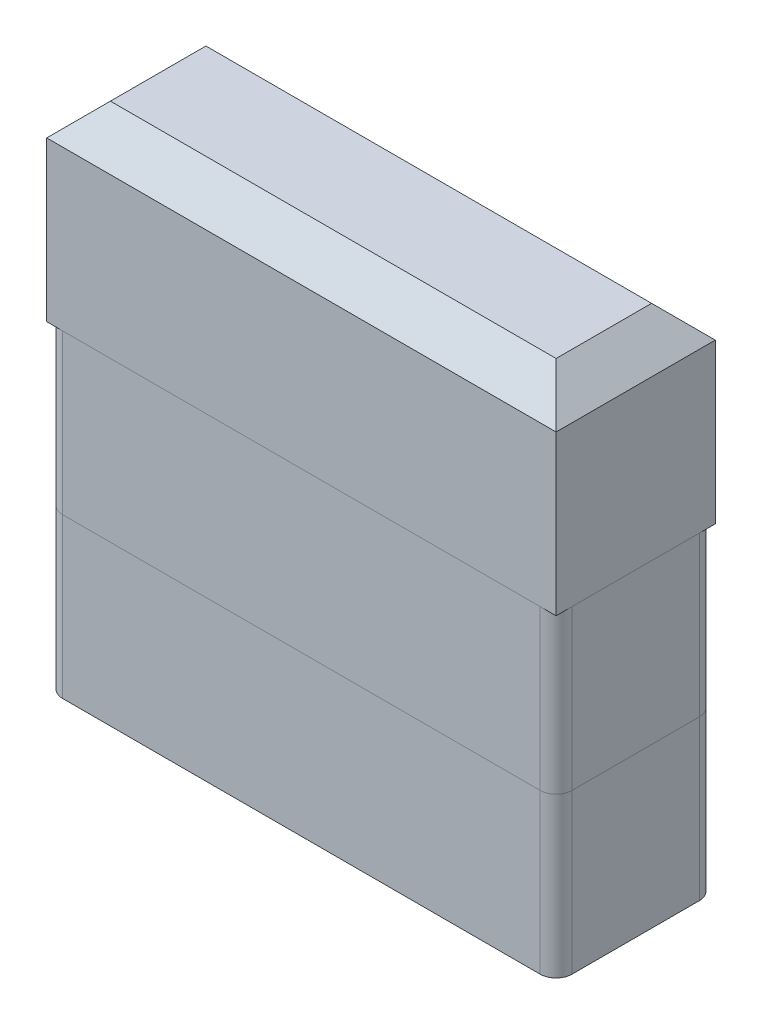
ISO-10303-21;
HEADER;
FILE_DESCRIPTION(('STEP AP214'),'2;1');
FILE_NAME('part.step','',(''),(''),'','','');
FILE_SCHEMA(('AUTOMOTIVE_DESIGN { 1 0 10303 214 1 1 1 1 }'));
ENDSEC;
DATA;
#1=APPLICATION_CONTEXT('core data for automotive mechanical design processes');
#2=APPLICATION_PROTOCOL_DEFINITION('international standard','automotive_design',2000,#1);
#3=PRODUCT_CONTEXT('',#1,'mechanical');
#4=PRODUCT('Part','Part','',(#3));
#5=PRODUCT_RELATED_PRODUCT_CATEGORY('part','',(#4));
#6=PRODUCT_DEFINITION_FORMATION('','',#4);
#7=PRODUCT_DEFINITION_CONTEXT('part definition',#1,'design');
#8=PRODUCT_DEFINITION('design','',#6,#7);
#9=PRODUCT_DEFINITION_SHAPE('','',#8);
#10=(LENGTH_UNIT() NAMED_UNIT(*) SI_UNIT(.MILLI.,.METRE.));
#11=(NAMED_UNIT(*) PLANE_ANGLE_UNIT() SI_UNIT($,.RADIAN.));
#12=(NAMED_UNIT(*) SI_UNIT($,.STERADIAN.) SOLID_ANGLE_UNIT());
#13=UNCERTAINTY_MEASURE_WITH_UNIT(LENGTH_MEASURE(1.E-05),#10,'distance_accuracy_value','');
#14=(GEOMETRIC_REPRESENTATION_CONTEXT(3) GLOBAL_UNCERTAINTY_ASSIGNED_CONTEXT((#13)) GLOBAL_UNIT_ASSIGNED_CONTEXT((#10,
#11,#12)) REPRESENTATION_CONTEXT('',''));
#15=CARTESIAN_POINT('',(0.,0.,0.));
#16=DIRECTION('',(0.,0.,1.));
#17=DIRECTION('',(1.,0.,0.));
#18=AXIS2_PLACEMENT_3D('',#15,#16,#17);
#19=CARTESIAN_POINT('',(0.,100.,0.));
#20=DIRECTION('',(0.,1.,0.));
#21=DIRECTION('',(0.,0.,1.));
#22=AXIS2_PLACEMENT_3D('',#19,#20,#21);
#23=PLANE('',#22);
#24=DIRECTION('',(-1.,0.,0.));
#25=VECTOR('',#24,1.);
#26=CARTESIAN_POINT('',(-80.,100.,-25.));
#27=LINE('',#26,#25);
#28=CARTESIAN_POINT('',(75.,100.,-25.));
#29=VERTEX_POINT('',#28);
#30=CARTESIAN_POINT('',(-75.,100.,-25.));
#31=VERTEX_POINT('',#30);
#32=EDGE_CURVE('E118',#29,#31,#27,.T.);
#33=ORIENTED_EDGE('',*,*,#32,.T.);
#34=CARTESIAN_POINT('',(-75.,100.,-20.));
#35=DIRECTION('',(0.,1.,0.));
#36=DIRECTION('',(0.,0.,1.));
#37=AXIS2_PLACEMENT_3D('',#34,#35,#36);
#38=CIRCLE('',#37,5.);
#39=CARTESIAN_POINT('',(-80.,100.,-20.));
#40=VERTEX_POINT('',#39);
#41=EDGE_CURVE('E114',#31,#40,#38,.T.);
#42=ORIENTED_EDGE('',*,*,#41,.T.);
#43=DIRECTION('',(0.,0.,1.));
#44=VECTOR('',#43,1.);
#45=CARTESIAN_POINT('',(-80.,100.,25.));
#46=LINE('',#45,#44);
#47=CARTESIAN_POINT('',(-80.,100.,20.));
#48=VERTEX_POINT('',#47);
#49=EDGE_CURVE('E116',#40,#48,#46,.T.);
#50=ORIENTED_EDGE('',*,*,#49,.T.);
#51=CARTESIAN_POINT('',(-75.,100.,20.));
#52=DIRECTION('',(0.,1.,0.));
#53=DIRECTION('',(0.,0.,1.));
#54=AXIS2_PLACEMENT_3D('',#51,#52,#53);
#55=CIRCLE('',#54,5.);
#56=CARTESIAN_POINT('',(-75.,100.,25.));
#57=VERTEX_POINT('',#56);
#58=EDGE_CURVE('E70',#48,#57,#55,.T.);
#59=ORIENTED_EDGE('',*,*,#58,.T.);
#60=DIRECTION('',(1.,0.,0.));
#61=VECTOR('',#60,1.);
#62=CARTESIAN_POINT('',(-80.,100.,25.));
#63=LINE('',#62,#61);
#64=CARTESIAN_POINT('',(75.,100.,25.));
#65=VERTEX_POINT('',#64);
#66=EDGE_CURVE('E134',#57,#65,#63,.T.);
#67=ORIENTED_EDGE('',*,*,#66,.T.);
#68=CARTESIAN_POINT('',(75.,100.,20.));
#69=DIRECTION('',(0.,1.,0.));
#70=DIRECTION('',(0.,0.,1.));
#71=AXIS2_PLACEMENT_3D('',#68,#69,#70);
#72=CIRCLE('',#71,5.);
#73=CARTESIAN_POINT('',(80.,100.,20.));
#74=VERTEX_POINT('',#73);
#75=EDGE_CURVE('E156',#65,#74,#72,.T.);
#76=ORIENTED_EDGE('',*,*,#75,.T.);
#77=DIRECTION('',(0.,0.,-1.));
#78=VECTOR('',#77,1.);
#79=CARTESIAN_POINT('',(80.,100.,25.));
#80=LINE('',#79,#78);
#81=CARTESIAN_POINT('',(80.,100.,-20.));
#82=VERTEX_POINT('',#81);
#83=EDGE_CURVE('E133',#74,#82,#80,.T.);
#84=ORIENTED_EDGE('',*,*,#83,.T.);
#85=CARTESIAN_POINT('',(75.,100.,-20.));
#86=DIRECTION('',(0.,1.,0.));
#87=DIRECTION('',(0.,0.,1.));
#88=AXIS2_PLACEMENT_3D('',#85,#86,#87);
#89=CIRCLE('',#88,5.);
#90=EDGE_CURVE('E123',#82,#29,#89,.T.);
#91=ORIENTED_EDGE('',*,*,#90,.T.);
#92=EDGE_LOOP('',(#33,#42,#50,#59,#67,#76,#84,#91));
#93=FACE_BOUND('',#92,.T.);
#94=ADVANCED_FACE('F50',(#93),#23,.T.);
#95=CARTESIAN_POINT('',(-80.,160.,-25.));
#96=DIRECTION('',(0.,0.,1.));
#97=DIRECTION('',(1.,0.,0.));
#98=AXIS2_PLACEMENT_3D('',#95,#96,#97);
#99=PLANE('',#98);
#100=DIRECTION('',(-1.,0.,0.));
#101=VECTOR('',#100,1.);
#102=CARTESIAN_POINT('',(-80.,50.,-25.));
#103=LINE('',#102,#101);
#104=CARTESIAN_POINT('',(75.,50.,-25.));
#105=VERTEX_POINT('',#104);
#106=CARTESIAN_POINT('',(-75.,50.,-25.));
#107=VERTEX_POINT('',#106);
#108=EDGE_CURVE('E172',#105,#107,#103,.T.);
#109=ORIENTED_EDGE('',*,*,#108,.T.);
#110=DIRECTION('',(0.,-1.,0.));
#111=VECTOR('',#110,1.);
#112=CARTESIAN_POINT('',(-75.,160.,-25.));
#113=LINE('',#112,#111);
#114=EDGE_CURVE('E153',#107,#31,#113,.F.);
#115=ORIENTED_EDGE('',*,*,#114,.T.);
#116=ORIENTED_EDGE('',*,*,#32,.F.);
#117=DIRECTION('',(0.,-1.,0.));
#118=VECTOR('',#117,1.);
#119=CARTESIAN_POINT('',(75.,160.,-25.));
#120=LINE('',#119,#118);
#121=EDGE_CURVE('E150',#29,#105,#120,.T.);
#122=ORIENTED_EDGE('',*,*,#121,.T.);
#123=EDGE_LOOP('',(#109,#115,#116,#122));
#124=FACE_BOUND('',#123,.T.);
#125=ADVANCED_FACE('F192',(#124),#99,.F.);
#126=CARTESIAN_POINT('',(80.,160.,25.));
#127=DIRECTION('',(-1.,0.,0.));
#128=DIRECTION('',(0.,0.,1.));
#129=AXIS2_PLACEMENT_3D('',#126,#127,#128);
#130=PLANE('',#129);
#131=DIRECTION('',(0.,0.,-1.));
#132=VECTOR('',#131,1.);
#133=CARTESIAN_POINT('',(80.,50.,25.));
#134=LINE('',#133,#132);
#135=CARTESIAN_POINT('',(80.,50.,20.));
#136=VERTEX_POINT('',#135);
#137=CARTESIAN_POINT('',(80.,50.,-20.));
#138=VERTEX_POINT('',#137);
#139=EDGE_CURVE('E177',#136,#138,#134,.T.);
#140=ORIENTED_EDGE('',*,*,#139,.T.);
#141=DIRECTION('',(0.,-1.,0.));
#142=VECTOR('',#141,1.);
#143=CARTESIAN_POINT('',(80.,160.,-20.));
#144=LINE('',#143,#142);
#145=EDGE_CURVE('E161',#138,#82,#144,.F.);
#146=ORIENTED_EDGE('',*,*,#145,.T.);
#147=ORIENTED_EDGE('',*,*,#83,.F.);
#148=DIRECTION('',(0.,-1.,0.));
#149=VECTOR('',#148,1.);
#150=CARTESIAN_POINT('',(80.,160.,20.));
#151=LINE('',#150,#149);
#152=EDGE_CURVE('E122',#74,#136,#151,.T.);
#153=ORIENTED_EDGE('',*,*,#152,.T.);
#154=EDGE_LOOP('',(#140,#146,#147,#153));
#155=FACE_BOUND('',#154,.T.);
#156=ADVANCED_FACE('F186',(#155),#130,.F.);
#157=CARTESIAN_POINT('',(-80.,160.,25.));
#158=DIRECTION('',(1.,0.,0.));
#159=DIRECTION('',(0.,0.,-1.));
#160=AXIS2_PLACEMENT_3D('',#157,#158,#159);
#161=PLANE('',#160);
#162=ORIENTED_EDGE('',*,*,#49,.F.);
#163=DIRECTION('',(0.,-1.,0.));
#164=VECTOR('',#163,1.);
#165=CARTESIAN_POINT('',(-80.,160.,-20.));
#166=LINE('',#165,#164);
#167=CARTESIAN_POINT('',(-80.,50.,-20.));
#168=VERTEX_POINT('',#167);
#169=EDGE_CURVE('E129',#40,#168,#166,.T.);
#170=ORIENTED_EDGE('',*,*,#169,.T.);
#171=DIRECTION('',(0.,0.,1.));
#172=VECTOR('',#171,1.);
#173=CARTESIAN_POINT('',(-80.,50.,25.));
#174=LINE('',#173,#172);
#175=CARTESIAN_POINT('',(-80.,50.,20.));
#176=VERTEX_POINT('',#175);
#177=EDGE_CURVE('E170',#168,#176,#174,.T.);
#178=ORIENTED_EDGE('',*,*,#177,.T.);
#179=DIRECTION('',(0.,-1.,0.));
#180=VECTOR('',#179,1.);
#181=CARTESIAN_POINT('',(-80.,160.,20.));
#182=LINE('',#181,#180);
#183=EDGE_CURVE('E132',#176,#48,#182,.F.);
#184=ORIENTED_EDGE('',*,*,#183,.T.);
#185=EDGE_LOOP('',(#162,#170,#178,#184));
#186=FACE_BOUND('',#185,.T.);
#187=ADVANCED_FACE('F127',(#186),#161,.F.);
#188=CARTESIAN_POINT('',(-80.,160.,25.));
#189=DIRECTION('',(0.,0.,-1.));
#190=DIRECTION('',(-1.,0.,0.));
#191=AXIS2_PLACEMENT_3D('',#188,#189,#190);
#192=PLANE('',#191);
#193=DIRECTION('',(1.,0.,0.));
#194=VECTOR('',#193,1.);
#195=CARTESIAN_POINT('',(-80.,50.,25.));
#196=LINE('',#195,#194);
#197=CARTESIAN_POINT('',(-75.,50.,25.));
#198=VERTEX_POINT('',#197);
#199=CARTESIAN_POINT('',(75.,50.,25.));
#200=VERTEX_POINT('',#199);
#201=EDGE_CURVE('E142',#198,#200,#196,.T.);
#202=ORIENTED_EDGE('',*,*,#201,.T.);
#203=DIRECTION('',(0.,-1.,0.));
#204=VECTOR('',#203,1.);
#205=CARTESIAN_POINT('',(75.,160.,25.));
#206=LINE('',#205,#204);
#207=EDGE_CURVE('E12',#200,#65,#206,.F.);
#208=ORIENTED_EDGE('',*,*,#207,.T.);
#209=ORIENTED_EDGE('',*,*,#66,.F.);
#210=DIRECTION('',(0.,-1.,0.));
#211=VECTOR('',#210,1.);
#212=CARTESIAN_POINT('',(-75.,160.,25.));
#213=LINE('',#212,#211);
#214=EDGE_CURVE('E58',#57,#198,#213,.T.);
#215=ORIENTED_EDGE('',*,*,#214,.T.);
#216=EDGE_LOOP('',(#202,#208,#209,#215));
#217=FACE_BOUND('',#216,.T.);
#218=ADVANCED_FACE('F165',(#217),#192,.F.);
#219=CARTESIAN_POINT('',(0.,50.,0.));
#220=DIRECTION('',(0.,1.,0.));
#221=DIRECTION('',(0.,0.,1.));
#222=AXIS2_PLACEMENT_3D('',#219,#220,#221);
#223=PLANE('',#222);
#224=ORIENTED_EDGE('',*,*,#177,.F.);
#225=CARTESIAN_POINT('',(-75.,50.,-20.));
#226=DIRECTION('',(0.,1.,0.));
#227=DIRECTION('',(0.,0.,1.));
#228=AXIS2_PLACEMENT_3D('',#225,#226,#227);
#229=CIRCLE('',#228,5.);
#230=EDGE_CURVE('E137',#168,#107,#229,.F.);
#231=ORIENTED_EDGE('',*,*,#230,.T.);
#232=ORIENTED_EDGE('',*,*,#108,.F.);
#233=CARTESIAN_POINT('',(75.,50.,-20.));
#234=DIRECTION('',(0.,1.,0.));
#235=DIRECTION('',(0.,0.,1.));
#236=AXIS2_PLACEMENT_3D('',#233,#234,#235);
#237=CIRCLE('',#236,5.);
#238=EDGE_CURVE('E147',#105,#138,#237,.F.);
#239=ORIENTED_EDGE('',*,*,#238,.T.);
#240=ORIENTED_EDGE('',*,*,#139,.F.);
#241=CARTESIAN_POINT('',(75.,50.,20.));
#242=DIRECTION('',(0.,1.,0.));
#243=DIRECTION('',(0.,0.,1.));
#244=AXIS2_PLACEMENT_3D('',#241,#242,#243);
#245=CIRCLE('',#244,5.);
#246=EDGE_CURVE('E140',#136,#200,#245,.F.);
#247=ORIENTED_EDGE('',*,*,#246,.T.);
#248=ORIENTED_EDGE('',*,*,#201,.F.);
#249=CARTESIAN_POINT('',(-75.,50.,20.));
#250=DIRECTION('',(0.,1.,0.));
#251=DIRECTION('',(0.,0.,1.));
#252=AXIS2_PLACEMENT_3D('',#249,#250,#251);
#253=CIRCLE('',#252,5.);
#254=EDGE_CURVE('E138',#198,#176,#253,.F.);
#255=ORIENTED_EDGE('',*,*,#254,.T.);
#256=EDGE_LOOP('',(#224,#231,#232,#239,#240,#247,#248,#255));
#257=FACE_BOUND('',#256,.T.);
#258=ADVANCED_FACE('F168',(#257),#223,.F.);
#259=CARTESIAN_POINT('',(-75.,160.,-20.));
#260=DIRECTION('',(0.,-1.,0.));
#261=DIRECTION('',(0.,0.,-1.));
#262=AXIS2_PLACEMENT_3D('',#259,#260,#261);
#263=CYLINDRICAL_SURFACE('',#262,5.);
#264=ORIENTED_EDGE('',*,*,#41,.F.);
#265=ORIENTED_EDGE('',*,*,#114,.F.);
#266=ORIENTED_EDGE('',*,*,#230,.F.);
#267=ORIENTED_EDGE('',*,*,#169,.F.);
#268=EDGE_LOOP('',(#264,#265,#266,#267));
#269=FACE_BOUND('',#268,.T.);
#270=ADVANCED_FACE('F136',(#269),#263,.T.);
#271=CARTESIAN_POINT('',(75.,160.,-20.));
#272=DIRECTION('',(0.,-1.,0.));
#273=DIRECTION('',(0.,0.,-1.));
#274=AXIS2_PLACEMENT_3D('',#271,#272,#273);
#275=CYLINDRICAL_SURFACE('',#274,5.);
#276=ORIENTED_EDGE('',*,*,#90,.F.);
#277=ORIENTED_EDGE('',*,*,#145,.F.);
#278=ORIENTED_EDGE('',*,*,#238,.F.);
#279=ORIENTED_EDGE('',*,*,#121,.F.);
#280=EDGE_LOOP('',(#276,#277,#278,#279));
#281=FACE_BOUND('',#280,.T.);
#282=ADVANCED_FACE('F198',(#281),#275,.T.);
#283=CARTESIAN_POINT('',(75.,160.,20.));
#284=DIRECTION('',(0.,-1.,0.));
#285=DIRECTION('',(0.,0.,-1.));
#286=AXIS2_PLACEMENT_3D('',#283,#284,#285);
#287=CYLINDRICAL_SURFACE('',#286,5.);
#288=ORIENTED_EDGE('',*,*,#75,.F.);
#289=ORIENTED_EDGE('',*,*,#207,.F.);
#290=ORIENTED_EDGE('',*,*,#246,.F.);
#291=ORIENTED_EDGE('',*,*,#152,.F.);
#292=EDGE_LOOP('',(#288,#289,#290,#291));
#293=FACE_BOUND('',#292,.T.);
#294=ADVANCED_FACE('F183',(#293),#287,.T.);
#295=CARTESIAN_POINT('',(-75.,160.,20.));
#296=DIRECTION('',(0.,-1.,0.));
#297=DIRECTION('',(0.,0.,-1.));
#298=AXIS2_PLACEMENT_3D('',#295,#296,#297);
#299=CYLINDRICAL_SURFACE('',#298,5.);
#300=ORIENTED_EDGE('',*,*,#58,.F.);
#301=ORIENTED_EDGE('',*,*,#183,.F.);
#302=ORIENTED_EDGE('',*,*,#254,.F.);
#303=ORIENTED_EDGE('',*,*,#214,.F.);
#304=EDGE_LOOP('',(#300,#301,#302,#303));
#305=FACE_BOUND('',#304,.T.);
#306=ADVANCED_FACE('F52',(#305),#299,.T.);
#307=CLOSED_SHELL('',(#94,#125,#156,#187,#218,#258,#270,#282,#294,#306));
#308=MANIFOLD_SOLID_BREP('B2',#307);
#309=CARTESIAN_POINT('',(0.,100.,0.));
#310=DIRECTION('',(0.,1.,0.));
#311=DIRECTION('',(0.,0.,1.));
#312=AXIS2_PLACEMENT_3D('',#309,#310,#311);
#313=PLANE('',#312);
#314=DIRECTION('',(0.,0.,-1.));
#315=VECTOR('',#314,1.);
#316=CARTESIAN_POINT('',(80.,100.,25.));
#317=LINE('',#316,#315);
#318=CARTESIAN_POINT('',(80.,100.,25.));
#319=VERTEX_POINT('',#318);
#320=CARTESIAN_POINT('',(80.,100.,-25.));
#321=VERTEX_POINT('',#320);
#322=EDGE_CURVE('E309',#319,#321,#317,.T.);
#323=ORIENTED_EDGE('',*,*,#322,.F.);
#324=DIRECTION('',(1.,0.,0.));
#325=VECTOR('',#324,1.);
#326=CARTESIAN_POINT('',(-80.,100.,25.));
#327=LINE('',#326,#325);
#328=CARTESIAN_POINT('',(-80.,100.,25.));
#329=VERTEX_POINT('',#328);
#330=EDGE_CURVE('E388',#329,#319,#327,.T.);
#331=ORIENTED_EDGE('',*,*,#330,.F.);
#332=DIRECTION('',(0.,0.,1.));
#333=VECTOR('',#332,1.);
#334=CARTESIAN_POINT('',(-80.,100.,25.));
#335=LINE('',#334,#333);
#336=CARTESIAN_POINT('',(-80.,100.,-25.));
#337=VERTEX_POINT('',#336);
#338=EDGE_CURVE('E397',#337,#329,#335,.T.);
#339=ORIENTED_EDGE('',*,*,#338,.F.);
#340=DIRECTION('',(-1.,0.,0.));
#341=VECTOR('',#340,1.);
#342=CARTESIAN_POINT('',(-80.,100.,-25.));
#343=LINE('',#342,#341);
#344=EDGE_CURVE('E48',#321,#337,#343,.T.);
#345=ORIENTED_EDGE('',*,*,#344,.F.);
#346=EDGE_LOOP('',(#323,#331,#339,#345));
#347=FACE_BOUND('',#346,.T.);
#348=ADVANCED_FACE('F302',(#347),#313,.F.);
#349=CARTESIAN_POINT('',(0.,160.,0.));
#350=DIRECTION('',(0.,-1.,0.));
#351=DIRECTION('',(0.,0.,-1.));
#352=AXIS2_PLACEMENT_3D('',#349,#350,#351);
#353=PLANE('',#352);
#354=DIRECTION('',(0.,0.,1.));
#355=VECTOR('',#354,1.);
#356=CARTESIAN_POINT('',(-70.,160.,0.));
#357=LINE('',#356,#355);
#358=CARTESIAN_POINT('',(-70.,160.,-15.));
#359=VERTEX_POINT('',#358);
#360=CARTESIAN_POINT('',(-70.,160.,15.));
#361=VERTEX_POINT('',#360);
#362=EDGE_CURVE('E376',#359,#361,#357,.T.);
#363=ORIENTED_EDGE('',*,*,#362,.T.);
#364=DIRECTION('',(1.,0.,0.));
#365=VECTOR('',#364,1.);
#366=CARTESIAN_POINT('',(0.,160.,15.));
#367=LINE('',#366,#365);
#368=CARTESIAN_POINT('',(70.,160.,15.));
#369=VERTEX_POINT('',#368);
#370=EDGE_CURVE('E357',#361,#369,#367,.T.);
#371=ORIENTED_EDGE('',*,*,#370,.T.);
#372=DIRECTION('',(0.,0.,-1.));
#373=VECTOR('',#372,1.);
#374=CARTESIAN_POINT('',(70.,160.,0.));
#375=LINE('',#374,#373);
#376=CARTESIAN_POINT('',(70.,160.,-15.));
#377=VERTEX_POINT('',#376);
#378=EDGE_CURVE('E365',#369,#377,#375,.T.);
#379=ORIENTED_EDGE('',*,*,#378,.T.);
#380=DIRECTION('',(-1.,0.,0.));
#381=VECTOR('',#380,1.);
#382=CARTESIAN_POINT('',(0.,160.,-15.));
#383=LINE('',#382,#381);
#384=EDGE_CURVE('E371',#377,#359,#383,.T.);
#385=ORIENTED_EDGE('',*,*,#384,.T.);
#386=EDGE_LOOP('',(#363,#371,#379,#385));
#387=FACE_BOUND('',#386,.T.);
#388=ADVANCED_FACE('F374',(#387),#353,.F.);
#389=CARTESIAN_POINT('',(0.,160.,-15.));
#390=DIRECTION('',(0.,-0.707106781186545,0.707106781186549));
#391=DIRECTION('',(-1.,0.,0.));
#392=AXIS2_PLACEMENT_3D('',#389,#390,#391);
#393=PLANE('',#392);
#394=DIRECTION('',(-0.577350269189625,0.577350269189628,0.577350269189625));
#395=VECTOR('',#394,1.);
#396=CARTESIAN_POINT('',(65.,165.,-10.));
#397=LINE('',#396,#395);
#398=CARTESIAN_POINT('',(80.,150.,-25.));
#399=VERTEX_POINT('',#398);
#400=EDGE_CURVE('E368',#399,#377,#397,.T.);
#401=ORIENTED_EDGE('',*,*,#400,.F.);
#402=DIRECTION('',(1.,0.,0.));
#403=VECTOR('',#402,1.);
#404=CARTESIAN_POINT('',(-80.,150.,-25.));
#405=LINE('',#404,#403);
#406=CARTESIAN_POINT('',(-80.,150.,-25.));
#407=VERTEX_POINT('',#406);
#408=EDGE_CURVE('E385',#407,#399,#405,.T.);
#409=ORIENTED_EDGE('',*,*,#408,.F.);
#410=DIRECTION('',(0.577350269189625,0.577350269189628,0.577350269189625));
#411=VECTOR('',#410,1.);
#412=CARTESIAN_POINT('',(-46.6666666666668,183.333333333333,8.33333333333323));
#413=LINE('',#412,#411);
#414=EDGE_CURVE('E392',#359,#407,#413,.F.);
#415=ORIENTED_EDGE('',*,*,#414,.F.);
#416=ORIENTED_EDGE('',*,*,#384,.F.);
#417=EDGE_LOOP('',(#401,#409,#415,#416));
#418=FACE_BOUND('',#417,.T.);
#419=ADVANCED_FACE('F414',(#418),#393,.F.);
#420=CARTESIAN_POINT('',(70.,160.,0.));
#421=DIRECTION('',(-0.707106781186549,-0.707106781186545,0.));
#422=DIRECTION('',(0.,0.,-1.));
#423=AXIS2_PLACEMENT_3D('',#420,#421,#422);
#424=PLANE('',#423);
#425=ORIENTED_EDGE('',*,*,#400,.T.);
#426=ORIENTED_EDGE('',*,*,#378,.F.);
#427=DIRECTION('',(0.577350269189625,-0.577350269189628,0.577350269189625));
#428=VECTOR('',#427,1.);
#429=CARTESIAN_POINT('',(65.,165.,10.));
#430=LINE('',#429,#428);
#431=CARTESIAN_POINT('',(80.,150.,25.));
#432=VERTEX_POINT('',#431);
#433=EDGE_CURVE('E353',#432,#369,#430,.F.);
#434=ORIENTED_EDGE('',*,*,#433,.F.);
#435=DIRECTION('',(0.,0.,1.));
#436=VECTOR('',#435,1.);
#437=CARTESIAN_POINT('',(80.,150.,25.));
#438=LINE('',#437,#436);
#439=EDGE_CURVE('E387',#399,#432,#438,.T.);
#440=ORIENTED_EDGE('',*,*,#439,.F.);
#441=EDGE_LOOP('',(#425,#426,#434,#440));
#442=FACE_BOUND('',#441,.T.);
#443=ADVANCED_FACE('F366',(#442),#424,.F.);
#444=CARTESIAN_POINT('',(-70.,160.,0.));
#445=DIRECTION('',(0.707106781186549,-0.707106781186545,0.));
#446=DIRECTION('',(0.,0.,1.));
#447=AXIS2_PLACEMENT_3D('',#444,#445,#446);
#448=PLANE('',#447);
#449=ORIENTED_EDGE('',*,*,#414,.T.);
#450=DIRECTION('',(0.,0.,-1.));
#451=VECTOR('',#450,1.);
#452=CARTESIAN_POINT('',(-80.,150.,25.));
#453=LINE('',#452,#451);
#454=CARTESIAN_POINT('',(-80.,150.,25.));
#455=VERTEX_POINT('',#454);
#456=EDGE_CURVE('E379',#455,#407,#453,.T.);
#457=ORIENTED_EDGE('',*,*,#456,.F.);
#458=DIRECTION('',(0.577350269189625,0.577350269189628,-0.577350269189625));
#459=VECTOR('',#458,1.);
#460=CARTESIAN_POINT('',(-65.,165.,10.));
#461=LINE('',#460,#459);
#462=EDGE_CURVE('E362',#361,#455,#461,.F.);
#463=ORIENTED_EDGE('',*,*,#462,.F.);
#464=ORIENTED_EDGE('',*,*,#362,.F.);
#465=EDGE_LOOP('',(#449,#457,#463,#464));
#466=FACE_BOUND('',#465,.T.);
#467=ADVANCED_FACE('F417',(#466),#448,.F.);
#468=CARTESIAN_POINT('',(-80.,160.,-25.));
#469=DIRECTION('',(0.,0.,1.));
#470=DIRECTION('',(1.,0.,0.));
#471=AXIS2_PLACEMENT_3D('',#468,#469,#470);
#472=PLANE('',#471);
#473=DIRECTION('',(0.,-1.,0.));
#474=VECTOR('',#473,1.);
#475=CARTESIAN_POINT('',(80.,160.,-25.));
#476=LINE('',#475,#474);
#477=EDGE_CURVE('E372',#399,#321,#476,.T.);
#478=ORIENTED_EDGE('',*,*,#477,.T.);
#479=ORIENTED_EDGE('',*,*,#344,.T.);
#480=DIRECTION('',(0.,-1.,0.));
#481=VECTOR('',#480,1.);
#482=CARTESIAN_POINT('',(-80.,160.,-25.));
#483=LINE('',#482,#481);
#484=EDGE_CURVE('E406',#407,#337,#483,.T.);
#485=ORIENTED_EDGE('',*,*,#484,.F.);
#486=ORIENTED_EDGE('',*,*,#408,.T.);
#487=EDGE_LOOP('',(#478,#479,#485,#486));
#488=FACE_BOUND('',#487,.T.);
#489=ADVANCED_FACE('F404',(#488),#472,.F.);
#490=CARTESIAN_POINT('',(0.,160.,15.));
#491=DIRECTION('',(0.,-0.707106781186545,-0.707106781186549));
#492=DIRECTION('',(1.,0.,0.));
#493=AXIS2_PLACEMENT_3D('',#490,#491,#492);
#494=PLANE('',#493);
#495=ORIENTED_EDGE('',*,*,#462,.T.);
#496=DIRECTION('',(-1.,0.,0.));
#497=VECTOR('',#496,1.);
#498=CARTESIAN_POINT('',(-80.,150.,25.));
#499=LINE('',#498,#497);
#500=EDGE_CURVE('E359',#432,#455,#499,.T.);
#501=ORIENTED_EDGE('',*,*,#500,.F.);
#502=ORIENTED_EDGE('',*,*,#433,.T.);
#503=ORIENTED_EDGE('',*,*,#370,.F.);
#504=EDGE_LOOP('',(#495,#501,#502,#503));
#505=FACE_BOUND('',#504,.T.);
#506=ADVANCED_FACE('F355',(#505),#494,.F.);
#507=CARTESIAN_POINT('',(80.,160.,25.));
#508=DIRECTION('',(-1.,0.,0.));
#509=DIRECTION('',(0.,0.,1.));
#510=AXIS2_PLACEMENT_3D('',#507,#508,#509);
#511=PLANE('',#510);
#512=DIRECTION('',(0.,-1.,0.));
#513=VECTOR('',#512,1.);
#514=CARTESIAN_POINT('',(80.,160.,25.));
#515=LINE('',#514,#513);
#516=EDGE_CURVE('E395',#432,#319,#515,.T.);
#517=ORIENTED_EDGE('',*,*,#516,.T.);
#518=ORIENTED_EDGE('',*,*,#322,.T.);
#519=ORIENTED_EDGE('',*,*,#477,.F.);
#520=ORIENTED_EDGE('',*,*,#439,.T.);
#521=EDGE_LOOP('',(#517,#518,#519,#520));
#522=FACE_BOUND('',#521,.T.);
#523=ADVANCED_FACE('F401',(#522),#511,.F.);
#524=CARTESIAN_POINT('',(-80.,160.,25.));
#525=DIRECTION('',(1.,0.,0.));
#526=DIRECTION('',(0.,0.,-1.));
#527=AXIS2_PLACEMENT_3D('',#524,#525,#526);
#528=PLANE('',#527);
#529=ORIENTED_EDGE('',*,*,#484,.T.);
#530=ORIENTED_EDGE('',*,*,#338,.T.);
#531=DIRECTION('',(0.,-1.,0.));
#532=VECTOR('',#531,1.);
#533=CARTESIAN_POINT('',(-80.,160.,25.));
#534=LINE('',#533,#532);
#535=EDGE_CURVE('E409',#455,#329,#534,.T.);
#536=ORIENTED_EDGE('',*,*,#535,.F.);
#537=ORIENTED_EDGE('',*,*,#456,.T.);
#538=EDGE_LOOP('',(#529,#530,#536,#537));
#539=FACE_BOUND('',#538,.T.);
#540=ADVANCED_FACE('F423',(#539),#528,.F.);
#541=CARTESIAN_POINT('',(-80.,160.,25.));
#542=DIRECTION('',(0.,0.,-1.));
#543=DIRECTION('',(-1.,0.,0.));
#544=AXIS2_PLACEMENT_3D('',#541,#542,#543);
#545=PLANE('',#544);
#546=ORIENTED_EDGE('',*,*,#535,.T.);
#547=ORIENTED_EDGE('',*,*,#330,.T.);
#548=ORIENTED_EDGE('',*,*,#516,.F.);
#549=ORIENTED_EDGE('',*,*,#500,.T.);
#550=EDGE_LOOP('',(#546,#547,#548,#549));
#551=FACE_BOUND('',#550,.T.);
#552=ADVANCED_FACE('F422',(#551),#545,.F.);
#553=CLOSED_SHELL('',(#348,#388,#419,#443,#467,#489,#506,#523,#540,#552));
#554=MANIFOLD_SOLID_BREP('B6',#553);
#555=CARTESIAN_POINT('',(0.,50.,0.));
#556=DIRECTION('',(0.,1.,0.));
#557=DIRECTION('',(0.,0.,1.));
#558=AXIS2_PLACEMENT_3D('',#555,#556,#557);
#559=PLANE('',#558);
#560=DIRECTION('',(-1.,0.,0.));
#561=VECTOR('',#560,1.);
#562=CARTESIAN_POINT('',(-80.,50.,-25.));
#563=LINE('',#562,#561);
#564=CARTESIAN_POINT('',(75.,50.,-25.));
#565=VERTEX_POINT('',#564);
#566=CARTESIAN_POINT('',(-75.,50.,-25.));
#567=VERTEX_POINT('',#566);
#568=EDGE_CURVE('E605',#565,#567,#563,.T.);
#569=ORIENTED_EDGE('',*,*,#568,.T.);
#570=CARTESIAN_POINT('',(-75.,50.,-20.));
#571=DIRECTION('',(0.,1.,0.));
#572=DIRECTION('',(0.,0.,1.));
#573=AXIS2_PLACEMENT_3D('',#570,#571,#572);
#574=CIRCLE('',#573,5.);
#575=CARTESIAN_POINT('',(-80.,50.,-20.));
#576=VERTEX_POINT('',#575);
#577=EDGE_CURVE('E600',#567,#576,#574,.T.);
#578=ORIENTED_EDGE('',*,*,#577,.T.);
#579=DIRECTION('',(0.,0.,1.));
#580=VECTOR('',#579,1.);
#581=CARTESIAN_POINT('',(-80.,50.,25.));
#582=LINE('',#581,#580);
#583=CARTESIAN_POINT('',(-80.,50.,20.));
#584=VERTEX_POINT('',#583);
#585=EDGE_CURVE('E602',#576,#584,#582,.T.);
#586=ORIENTED_EDGE('',*,*,#585,.T.);
#587=CARTESIAN_POINT('',(-75.,50.,20.));
#588=DIRECTION('',(0.,1.,0.));
#589=DIRECTION('',(0.,0.,1.));
#590=AXIS2_PLACEMENT_3D('',#587,#588,#589);
#591=CIRCLE('',#590,5.);
#592=CARTESIAN_POINT('',(-75.,50.,25.));
#593=VERTEX_POINT('',#592);
#594=EDGE_CURVE('E610',#584,#593,#591,.T.);
#595=ORIENTED_EDGE('',*,*,#594,.T.);
#596=DIRECTION('',(1.,0.,0.));
#597=VECTOR('',#596,1.);
#598=CARTESIAN_POINT('',(-80.,50.,25.));
#599=LINE('',#598,#597);
#600=CARTESIAN_POINT('',(75.,50.,25.));
#601=VERTEX_POINT('',#600);
#602=EDGE_CURVE('E620',#593,#601,#599,.T.);
#603=ORIENTED_EDGE('',*,*,#602,.T.);
#604=CARTESIAN_POINT('',(75.,50.,20.));
#605=DIRECTION('',(0.,1.,0.));
#606=DIRECTION('',(0.,0.,1.));
#607=AXIS2_PLACEMENT_3D('',#604,#605,#606);
#608=CIRCLE('',#607,5.);
#609=CARTESIAN_POINT('',(80.,50.,20.));
#610=VERTEX_POINT('',#609);
#611=EDGE_CURVE('E555',#601,#610,#608,.T.);
#612=ORIENTED_EDGE('',*,*,#611,.T.);
#613=DIRECTION('',(0.,0.,-1.));
#614=VECTOR('',#613,1.);
#615=CARTESIAN_POINT('',(80.,50.,25.));
#616=LINE('',#615,#614);
#617=CARTESIAN_POINT('',(80.,50.,-20.));
#618=VERTEX_POINT('',#617);
#619=EDGE_CURVE('E652',#610,#618,#616,.T.);
#620=ORIENTED_EDGE('',*,*,#619,.T.);
#621=CARTESIAN_POINT('',(75.,50.,-20.));
#622=DIRECTION('',(0.,1.,0.));
#623=DIRECTION('',(0.,0.,1.));
#624=AXIS2_PLACEMENT_3D('',#621,#622,#623);
#625=CIRCLE('',#624,5.);
#626=EDGE_CURVE('E642',#618,#565,#625,.T.);
#627=ORIENTED_EDGE('',*,*,#626,.T.);
#628=EDGE_LOOP('',(#569,#578,#586,#595,#603,#612,#620,#627));
#629=FACE_BOUND('',#628,.T.);
#630=ADVANCED_FACE('F535',(#629),#559,.T.);
#631=CARTESIAN_POINT('',(80.,160.,25.));
#632=DIRECTION('',(-1.,0.,0.));
#633=DIRECTION('',(0.,0.,1.));
#634=AXIS2_PLACEMENT_3D('',#631,#632,#633);
#635=PLANE('',#634);
#636=DIRECTION('',(0.,0.,-1.));
#637=VECTOR('',#636,1.);
#638=CARTESIAN_POINT('',(80.,0.,25.));
#639=LINE('',#638,#637);
#640=CARTESIAN_POINT('',(80.,0.,20.));
#641=VERTEX_POINT('',#640);
#642=CARTESIAN_POINT('',(80.,0.,-20.));
#643=VERTEX_POINT('',#642);
#644=EDGE_CURVE('E628',#641,#643,#639,.T.);
#645=ORIENTED_EDGE('',*,*,#644,.T.);
#646=DIRECTION('',(0.,-1.,0.));
#647=VECTOR('',#646,1.);
#648=CARTESIAN_POINT('',(80.,160.,-20.));
#649=LINE('',#648,#647);
#650=EDGE_CURVE('E300',#643,#618,#649,.F.);
#651=ORIENTED_EDGE('',*,*,#650,.T.);
#652=ORIENTED_EDGE('',*,*,#619,.F.);
#653=DIRECTION('',(0.,-1.,0.));
#654=VECTOR('',#653,1.);
#655=CARTESIAN_POINT('',(80.,160.,20.));
#656=LINE('',#655,#654);
#657=EDGE_CURVE('E543',#610,#641,#656,.T.);
#658=ORIENTED_EDGE('',*,*,#657,.T.);
#659=EDGE_LOOP('',(#645,#651,#652,#658));
#660=FACE_BOUND('',#659,.T.);
#661=ADVANCED_FACE('F651',(#660),#635,.F.);
#662=CARTESIAN_POINT('',(-80.,160.,-25.));
#663=DIRECTION('',(0.,0.,1.));
#664=DIRECTION('',(1.,0.,0.));
#665=AXIS2_PLACEMENT_3D('',#662,#663,#664);
#666=PLANE('',#665);
#667=DIRECTION('',(-1.,0.,0.));
#668=VECTOR('',#667,1.);
#669=CARTESIAN_POINT('',(-80.,0.,-25.));
#670=LINE('',#669,#668);
#671=CARTESIAN_POINT('',(75.,0.,-25.));
#672=VERTEX_POINT('',#671);
#673=CARTESIAN_POINT('',(-75.,0.,-25.));
#674=VERTEX_POINT('',#673);
#675=EDGE_CURVE('E659',#672,#674,#670,.T.);
#676=ORIENTED_EDGE('',*,*,#675,.T.);
#677=DIRECTION('',(0.,-1.,0.));
#678=VECTOR('',#677,1.);
#679=CARTESIAN_POINT('',(-75.,160.,-25.));
#680=LINE('',#679,#678);
#681=EDGE_CURVE('E639',#674,#567,#680,.F.);
#682=ORIENTED_EDGE('',*,*,#681,.T.);
#683=ORIENTED_EDGE('',*,*,#568,.F.);
#684=DIRECTION('',(0.,-1.,0.));
#685=VECTOR('',#684,1.);
#686=CARTESIAN_POINT('',(75.,160.,-25.));
#687=LINE('',#686,#685);
#688=EDGE_CURVE('E636',#565,#672,#687,.T.);
#689=ORIENTED_EDGE('',*,*,#688,.T.);
#690=EDGE_LOOP('',(#676,#682,#683,#689));
#691=FACE_BOUND('',#690,.T.);
#692=ADVANCED_FACE('F686',(#691),#666,.F.);
#693=CARTESIAN_POINT('',(-80.,160.,25.));
#694=DIRECTION('',(1.,0.,0.));
#695=DIRECTION('',(0.,0.,-1.));
#696=AXIS2_PLACEMENT_3D('',#693,#694,#695);
#697=PLANE('',#696);
#698=ORIENTED_EDGE('',*,*,#585,.F.);
#699=DIRECTION('',(0.,-1.,0.));
#700=VECTOR('',#699,1.);
#701=CARTESIAN_POINT('',(-80.,160.,-20.));
#702=LINE('',#701,#700);
#703=CARTESIAN_POINT('',(-80.,0.,-20.));
#704=VERTEX_POINT('',#703);
#705=EDGE_CURVE('E616',#576,#704,#702,.T.);
#706=ORIENTED_EDGE('',*,*,#705,.T.);
#707=DIRECTION('',(0.,0.,1.));
#708=VECTOR('',#707,1.);
#709=CARTESIAN_POINT('',(-80.,0.,25.));
#710=LINE('',#709,#708);
#711=CARTESIAN_POINT('',(-80.,0.,20.));
#712=VERTEX_POINT('',#711);
#713=EDGE_CURVE('E662',#704,#712,#710,.T.);
#714=ORIENTED_EDGE('',*,*,#713,.T.);
#715=DIRECTION('',(0.,-1.,0.));
#716=VECTOR('',#715,1.);
#717=CARTESIAN_POINT('',(-80.,160.,20.));
#718=LINE('',#717,#716);
#719=EDGE_CURVE('E619',#712,#584,#718,.F.);
#720=ORIENTED_EDGE('',*,*,#719,.T.);
#721=EDGE_LOOP('',(#698,#706,#714,#720));
#722=FACE_BOUND('',#721,.T.);
#723=ADVANCED_FACE('F614',(#722),#697,.F.);
#724=CARTESIAN_POINT('',(-80.,160.,25.));
#725=DIRECTION('',(0.,0.,-1.));
#726=DIRECTION('',(-1.,0.,0.));
#727=AXIS2_PLACEMENT_3D('',#724,#725,#726);
#728=PLANE('',#727);
#729=ORIENTED_EDGE('',*,*,#602,.F.);
#730=DIRECTION('',(0.,-1.,0.));
#731=VECTOR('',#730,1.);
#732=CARTESIAN_POINT('',(-75.,160.,25.));
#733=LINE('',#732,#731);
#734=CARTESIAN_POINT('',(-75.,0.,25.));
#735=VERTEX_POINT('',#734);
#736=EDGE_CURVE('E646',#593,#735,#733,.T.);
#737=ORIENTED_EDGE('',*,*,#736,.T.);
#738=DIRECTION('',(1.,0.,0.));
#739=VECTOR('',#738,1.);
#740=CARTESIAN_POINT('',(-80.,0.,25.));
#741=LINE('',#740,#739);
#742=CARTESIAN_POINT('',(75.,0.,25.));
#743=VERTEX_POINT('',#742);
#744=EDGE_CURVE('E667',#735,#743,#741,.T.);
#745=ORIENTED_EDGE('',*,*,#744,.T.);
#746=DIRECTION('',(0.,-1.,0.));
#747=VECTOR('',#746,1.);
#748=CARTESIAN_POINT('',(75.,160.,25.));
#749=LINE('',#748,#747);
#750=EDGE_CURVE('E609',#743,#601,#749,.F.);
#751=ORIENTED_EDGE('',*,*,#750,.T.);
#752=EDGE_LOOP('',(#729,#737,#745,#751));
#753=FACE_BOUND('',#752,.T.);
#754=ADVANCED_FACE('F672',(#753),#728,.F.);
#755=CARTESIAN_POINT('',(0.,0.,0.));
#756=DIRECTION('',(0.,-1.,0.));
#757=DIRECTION('',(0.,0.,-1.));
#758=AXIS2_PLACEMENT_3D('',#755,#756,#757);
#759=PLANE('',#758);
#760=ORIENTED_EDGE('',*,*,#713,.F.);
#761=CARTESIAN_POINT('',(-75.,0.,-20.));
#762=DIRECTION('',(0.,-1.,0.));
#763=DIRECTION('',(0.,0.,-1.));
#764=AXIS2_PLACEMENT_3D('',#761,#762,#763);
#765=CIRCLE('',#764,5.);
#766=EDGE_CURVE('E623',#704,#674,#765,.T.);
#767=ORIENTED_EDGE('',*,*,#766,.T.);
#768=ORIENTED_EDGE('',*,*,#675,.F.);
#769=CARTESIAN_POINT('',(75.,0.,-20.));
#770=DIRECTION('',(0.,-1.,0.));
#771=DIRECTION('',(0.,0.,-1.));
#772=AXIS2_PLACEMENT_3D('',#769,#770,#771);
#773=CIRCLE('',#772,5.);
#774=EDGE_CURVE('E626',#672,#643,#773,.T.);
#775=ORIENTED_EDGE('',*,*,#774,.T.);
#776=ORIENTED_EDGE('',*,*,#644,.F.);
#777=CARTESIAN_POINT('',(75.,0.,20.));
#778=DIRECTION('',(0.,-1.,0.));
#779=DIRECTION('',(0.,0.,-1.));
#780=AXIS2_PLACEMENT_3D('',#777,#778,#779);
#781=CIRCLE('',#780,5.);
#782=EDGE_CURVE('E624',#641,#743,#781,.T.);
#783=ORIENTED_EDGE('',*,*,#782,.T.);
#784=ORIENTED_EDGE('',*,*,#744,.F.);
#785=CARTESIAN_POINT('',(-75.,0.,20.));
#786=DIRECTION('',(0.,-1.,0.));
#787=DIRECTION('',(0.,0.,-1.));
#788=AXIS2_PLACEMENT_3D('',#785,#786,#787);
#789=CIRCLE('',#788,5.);
#790=EDGE_CURVE('E633',#735,#712,#789,.T.);
#791=ORIENTED_EDGE('',*,*,#790,.T.);
#792=EDGE_LOOP('',(#760,#767,#768,#775,#776,#783,#784,#791));
#793=FACE_BOUND('',#792,.T.);
#794=ADVANCED_FACE('F655',(#793),#759,.T.);
#795=CARTESIAN_POINT('',(-75.,160.,-20.));
#796=DIRECTION('',(0.,-1.,0.));
#797=DIRECTION('',(0.,0.,-1.));
#798=AXIS2_PLACEMENT_3D('',#795,#796,#797);
#799=CYLINDRICAL_SURFACE('',#798,5.);
#800=ORIENTED_EDGE('',*,*,#577,.F.);
#801=ORIENTED_EDGE('',*,*,#681,.F.);
#802=ORIENTED_EDGE('',*,*,#766,.F.);
#803=ORIENTED_EDGE('',*,*,#705,.F.);
#804=EDGE_LOOP('',(#800,#801,#802,#803));
#805=FACE_BOUND('',#804,.T.);
#806=ADVANCED_FACE('F622',(#805),#799,.T.);
#807=CARTESIAN_POINT('',(-75.,160.,20.));
#808=DIRECTION('',(0.,-1.,0.));
#809=DIRECTION('',(0.,0.,-1.));
#810=AXIS2_PLACEMENT_3D('',#807,#808,#809);
#811=CYLINDRICAL_SURFACE('',#810,5.);
#812=ORIENTED_EDGE('',*,*,#594,.F.);
#813=ORIENTED_EDGE('',*,*,#719,.F.);
#814=ORIENTED_EDGE('',*,*,#790,.F.);
#815=ORIENTED_EDGE('',*,*,#736,.F.);
#816=EDGE_LOOP('',(#812,#813,#814,#815));
#817=FACE_BOUND('',#816,.T.);
#818=ADVANCED_FACE('F675',(#817),#811,.T.);
#819=CARTESIAN_POINT('',(75.,160.,-20.));
#820=DIRECTION('',(0.,-1.,0.));
#821=DIRECTION('',(0.,0.,-1.));
#822=AXIS2_PLACEMENT_3D('',#819,#820,#821);
#823=CYLINDRICAL_SURFACE('',#822,5.);
#824=ORIENTED_EDGE('',*,*,#626,.F.);
#825=ORIENTED_EDGE('',*,*,#650,.F.);
#826=ORIENTED_EDGE('',*,*,#774,.F.);
#827=ORIENTED_EDGE('',*,*,#688,.F.);
#828=EDGE_LOOP('',(#824,#825,#826,#827));
#829=FACE_BOUND('',#828,.T.);
#830=ADVANCED_FACE('F677',(#829),#823,.T.);
#831=CARTESIAN_POINT('',(75.,160.,20.));
#832=DIRECTION('',(0.,-1.,0.));
#833=DIRECTION('',(0.,0.,-1.));
#834=AXIS2_PLACEMENT_3D('',#831,#832,#833);
#835=CYLINDRICAL_SURFACE('',#834,5.);
#836=ORIENTED_EDGE('',*,*,#611,.F.);
#837=ORIENTED_EDGE('',*,*,#750,.F.);
#838=ORIENTED_EDGE('',*,*,#782,.F.);
#839=ORIENTED_EDGE('',*,*,#657,.F.);
#840=EDGE_LOOP('',(#836,#837,#838,#839));
#841=FACE_BOUND('',#840,.T.);
#842=ADVANCED_FACE('F537',(#841),#835,.T.);
#843=CLOSED_SHELL('',(#630,#661,#692,#723,#754,#794,#806,#818,#830,#842));
#844=MANIFOLD_SOLID_BREP('B42',#843);
#845=ADVANCED_BREP_SHAPE_REPRESENTATION('',(#18,#308,#554,#844),#14);
#846=SHAPE_DEFINITION_REPRESENTATION(#9,#845);
ENDSEC;
END-ISO-10303-21;
